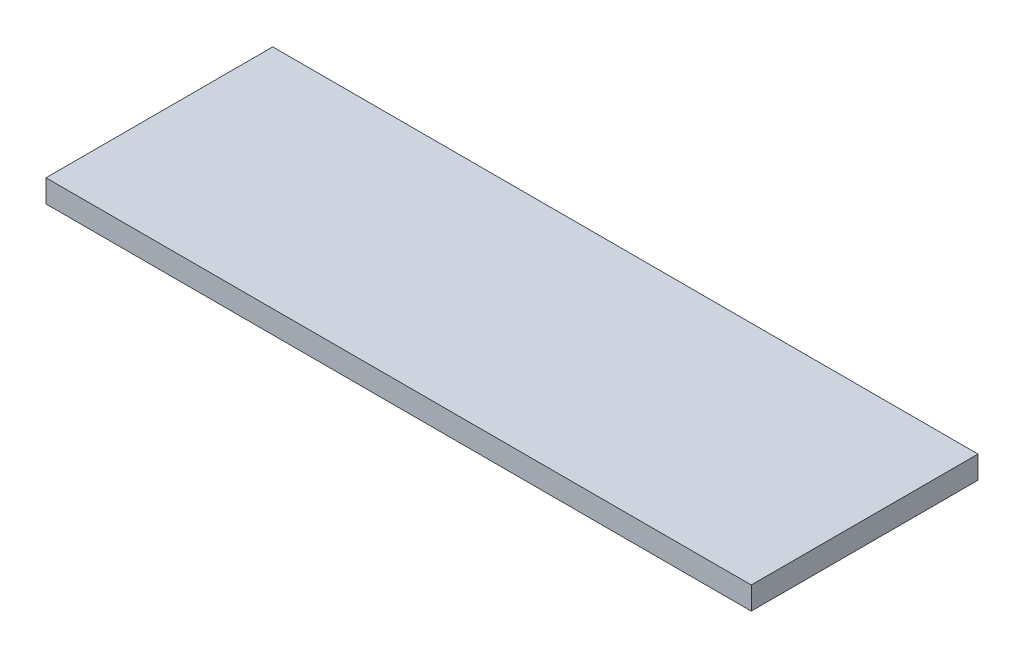
ISO-10303-21;
HEADER;
FILE_DESCRIPTION(('STEP AP214'),'2;1');
FILE_NAME('part.step','',(''),(''),'','','');
FILE_SCHEMA(('AUTOMOTIVE_DESIGN { 1 0 10303 214 1 1 1 1 }'));
ENDSEC;
DATA;
#1=APPLICATION_CONTEXT('core data for automotive mechanical design processes');
#2=APPLICATION_PROTOCOL_DEFINITION('international standard','automotive_design',2000,#1);
#3=PRODUCT_CONTEXT('',#1,'mechanical');
#4=PRODUCT('Part','Part','',(#3));
#5=PRODUCT_RELATED_PRODUCT_CATEGORY('part','',(#4));
#6=PRODUCT_DEFINITION_FORMATION('','',#4);
#7=PRODUCT_DEFINITION_CONTEXT('part definition',#1,'design');
#8=PRODUCT_DEFINITION('design','',#6,#7);
#9=PRODUCT_DEFINITION_SHAPE('','',#8);
#10=(LENGTH_UNIT() NAMED_UNIT(*) SI_UNIT(.MILLI.,.METRE.));
#11=(NAMED_UNIT(*) PLANE_ANGLE_UNIT() SI_UNIT($,.RADIAN.));
#12=(NAMED_UNIT(*) SI_UNIT($,.STERADIAN.) SOLID_ANGLE_UNIT());
#13=UNCERTAINTY_MEASURE_WITH_UNIT(LENGTH_MEASURE(1.E-05),#10,'distance_accuracy_value','');
#14=(GEOMETRIC_REPRESENTATION_CONTEXT(3) GLOBAL_UNCERTAINTY_ASSIGNED_CONTEXT((#13)) GLOBAL_UNIT_ASSIGNED_CONTEXT((#10,
#11,#12)) REPRESENTATION_CONTEXT('',''));
#15=CARTESIAN_POINT('',(0.,0.,0.));
#16=DIRECTION('',(0.,0.,1.));
#17=DIRECTION('',(1.,0.,0.));
#18=AXIS2_PLACEMENT_3D('',#15,#16,#17);
#19=CARTESIAN_POINT('',(-150.628547233686,4.,16.5202333043868));
#20=DIRECTION('',(1.,0.,0.));
#21=DIRECTION('',(0.,0.,-1.));
#22=AXIS2_PLACEMENT_3D('',#19,#20,#21);
#23=PLANE('',#22);
#24=DIRECTION('',(0.,0.,1.));
#25=VECTOR('',#24,1.);
#26=CARTESIAN_POINT('',(-150.628547233686,0.,16.5202333043868));
#27=LINE('',#26,#25);
#28=CARTESIAN_POINT('',(-150.628547233686,0.,16.5202333043868));
#29=VERTEX_POINT('',#28);
#30=CARTESIAN_POINT('',(-150.628547233686,0.,56.5202333043868));
#31=VERTEX_POINT('',#30);
#32=EDGE_CURVE('E86',#29,#31,#27,.T.);
#33=ORIENTED_EDGE('',*,*,#32,.T.);
#34=DIRECTION('',(0.,-1.,0.));
#35=VECTOR('',#34,1.);
#36=CARTESIAN_POINT('',(-150.628547233686,4.,56.5202333043868));
#37=LINE('',#36,#35);
#38=CARTESIAN_POINT('',(-150.628547233686,4.,56.5202333043868));
#39=VERTEX_POINT('',#38);
#40=EDGE_CURVE('E41',#39,#31,#37,.T.);
#41=ORIENTED_EDGE('',*,*,#40,.F.);
#42=DIRECTION('',(0.,0.,1.));
#43=VECTOR('',#42,1.);
#44=CARTESIAN_POINT('',(-150.628547233686,4.,16.5202333043868));
#45=LINE('',#44,#43);
#46=CARTESIAN_POINT('',(-150.628547233686,4.,16.5202333043868));
#47=VERTEX_POINT('',#46);
#48=EDGE_CURVE('E80',#47,#39,#45,.T.);
#49=ORIENTED_EDGE('',*,*,#48,.F.);
#50=DIRECTION('',(0.,-1.,0.));
#51=VECTOR('',#50,1.);
#52=CARTESIAN_POINT('',(-150.628547233686,4.,16.5202333043868));
#53=LINE('',#52,#51);
#54=EDGE_CURVE('E73',#47,#29,#53,.T.);
#55=ORIENTED_EDGE('',*,*,#54,.T.);
#56=EDGE_LOOP('',(#33,#41,#49,#55));
#57=FACE_BOUND('',#56,.T.);
#58=ADVANCED_FACE('F34',(#57),#23,.F.);
#59=CARTESIAN_POINT('',(-150.628547233686,4.,56.5202333043868));
#60=DIRECTION('',(0.,0.,-1.));
#61=DIRECTION('',(-1.,0.,0.));
#62=AXIS2_PLACEMENT_3D('',#59,#60,#61);
#63=PLANE('',#62);
#64=DIRECTION('',(1.,0.,0.));
#65=VECTOR('',#64,1.);
#66=CARTESIAN_POINT('',(-150.628547233686,0.,56.5202333043868));
#67=LINE('',#66,#65);
#68=CARTESIAN_POINT('',(-26.2140438236197,0.,56.5202333043868));
#69=VERTEX_POINT('',#68);
#70=EDGE_CURVE('E81',#31,#69,#67,.T.);
#71=ORIENTED_EDGE('',*,*,#70,.T.);
#72=DIRECTION('',(0.,1.,0.));
#73=VECTOR('',#72,1.);
#74=CARTESIAN_POINT('',(-26.2140438236197,4.,56.5202333043868));
#75=LINE('',#74,#73);
#76=CARTESIAN_POINT('',(-26.2140438236198,4.,56.5202333043868));
#77=VERTEX_POINT('',#76);
#78=EDGE_CURVE('E48',#69,#77,#75,.T.);
#79=ORIENTED_EDGE('',*,*,#78,.T.);
#80=DIRECTION('',(1.,0.,0.));
#81=VECTOR('',#80,1.);
#82=CARTESIAN_POINT('',(-150.628547233686,4.,56.5202333043868));
#83=LINE('',#82,#81);
#84=EDGE_CURVE('E100',#39,#77,#83,.T.);
#85=ORIENTED_EDGE('',*,*,#84,.F.);
#86=ORIENTED_EDGE('',*,*,#40,.T.);
#87=EDGE_LOOP('',(#71,#79,#85,#86));
#88=FACE_BOUND('',#87,.T.);
#89=ADVANCED_FACE('F98',(#88),#63,.F.);
#90=CARTESIAN_POINT('',(-150.628547233686,4.,16.5202333043868));
#91=DIRECTION('',(0.,0.,1.));
#92=DIRECTION('',(1.,0.,0.));
#93=AXIS2_PLACEMENT_3D('',#90,#91,#92);
#94=PLANE('',#93);
#95=DIRECTION('',(-1.,0.,0.));
#96=VECTOR('',#95,1.);
#97=CARTESIAN_POINT('',(-150.628547233686,4.,16.5202333043868));
#98=LINE('',#97,#96);
#99=CARTESIAN_POINT('',(-26.2140438236197,4.,16.5202333043868));
#100=VERTEX_POINT('',#99);
#101=EDGE_CURVE('E56',#100,#47,#98,.T.);
#102=ORIENTED_EDGE('',*,*,#101,.F.);
#103=DIRECTION('',(0.,-1.,0.));
#104=VECTOR('',#103,1.);
#105=CARTESIAN_POINT('',(-26.2140438236197,10.,16.5202333043868));
#106=LINE('',#105,#104);
#107=CARTESIAN_POINT('',(-26.2140438236197,0.,16.5202333043868));
#108=VERTEX_POINT('',#107);
#109=EDGE_CURVE('E77',#100,#108,#106,.T.);
#110=ORIENTED_EDGE('',*,*,#109,.T.);
#111=DIRECTION('',(-1.,0.,0.));
#112=VECTOR('',#111,1.);
#113=CARTESIAN_POINT('',(-150.628547233686,0.,16.5202333043868));
#114=LINE('',#113,#112);
#115=EDGE_CURVE('E70',#108,#29,#114,.T.);
#116=ORIENTED_EDGE('',*,*,#115,.T.);
#117=ORIENTED_EDGE('',*,*,#54,.F.);
#118=EDGE_LOOP('',(#102,#110,#116,#117));
#119=FACE_BOUND('',#118,.T.);
#120=ADVANCED_FACE('F72',(#119),#94,.F.);
#121=CARTESIAN_POINT('',(0.,4.,0.));
#122=DIRECTION('',(0.,1.,0.));
#123=DIRECTION('',(0.,0.,1.));
#124=AXIS2_PLACEMENT_3D('',#121,#122,#123);
#125=PLANE('',#124);
#126=DIRECTION('',(0.,0.,1.));
#127=VECTOR('',#126,1.);
#128=CARTESIAN_POINT('',(-26.2140438236197,4.,0.));
#129=LINE('',#128,#127);
#130=EDGE_CURVE('E93',#100,#77,#129,.T.);
#131=ORIENTED_EDGE('',*,*,#130,.F.);
#132=ORIENTED_EDGE('',*,*,#101,.T.);
#133=ORIENTED_EDGE('',*,*,#48,.T.);
#134=ORIENTED_EDGE('',*,*,#84,.T.);
#135=EDGE_LOOP('',(#131,#132,#133,#134));
#136=FACE_BOUND('',#135,.T.);
#137=ADVANCED_FACE('F101',(#136),#125,.T.);
#138=CARTESIAN_POINT('',(0.,0.,0.));
#139=DIRECTION('',(0.,1.,0.));
#140=DIRECTION('',(0.,0.,1.));
#141=AXIS2_PLACEMENT_3D('',#138,#139,#140);
#142=PLANE('',#141);
#143=ORIENTED_EDGE('',*,*,#115,.F.);
#144=DIRECTION('',(0.,0.,1.));
#145=VECTOR('',#144,1.);
#146=CARTESIAN_POINT('',(-26.2140438236197,0.,0.));
#147=LINE('',#146,#145);
#148=EDGE_CURVE('E11',#108,#69,#147,.T.);
#149=ORIENTED_EDGE('',*,*,#148,.T.);
#150=ORIENTED_EDGE('',*,*,#70,.F.);
#151=ORIENTED_EDGE('',*,*,#32,.F.);
#152=EDGE_LOOP('',(#143,#149,#150,#151));
#153=FACE_BOUND('',#152,.T.);
#154=ADVANCED_FACE('F88',(#153),#142,.F.);
#155=CARTESIAN_POINT('',(-26.2140438236197,10.,16.5202333043868));
#156=DIRECTION('',(-1.,0.,0.));
#157=DIRECTION('',(0.,0.,1.));
#158=AXIS2_PLACEMENT_3D('',#155,#156,#157);
#159=PLANE('',#158);
#160=ORIENTED_EDGE('',*,*,#148,.F.);
#161=ORIENTED_EDGE('',*,*,#109,.F.);
#162=ORIENTED_EDGE('',*,*,#130,.T.);
#163=ORIENTED_EDGE('',*,*,#78,.F.);
#164=EDGE_LOOP('',(#160,#161,#162,#163));
#165=FACE_BOUND('',#164,.T.);
#166=ADVANCED_FACE('F105',(#165),#159,.F.);
#167=CLOSED_SHELL('',(#58,#89,#120,#137,#154,#166));
#168=MANIFOLD_SOLID_BREP('B2',#167);
#169=ADVANCED_BREP_SHAPE_REPRESENTATION('',(#18,#168),#14);
#170=SHAPE_DEFINITION_REPRESENTATION(#9,#169);
ENDSEC;
END-ISO-10303-21;
